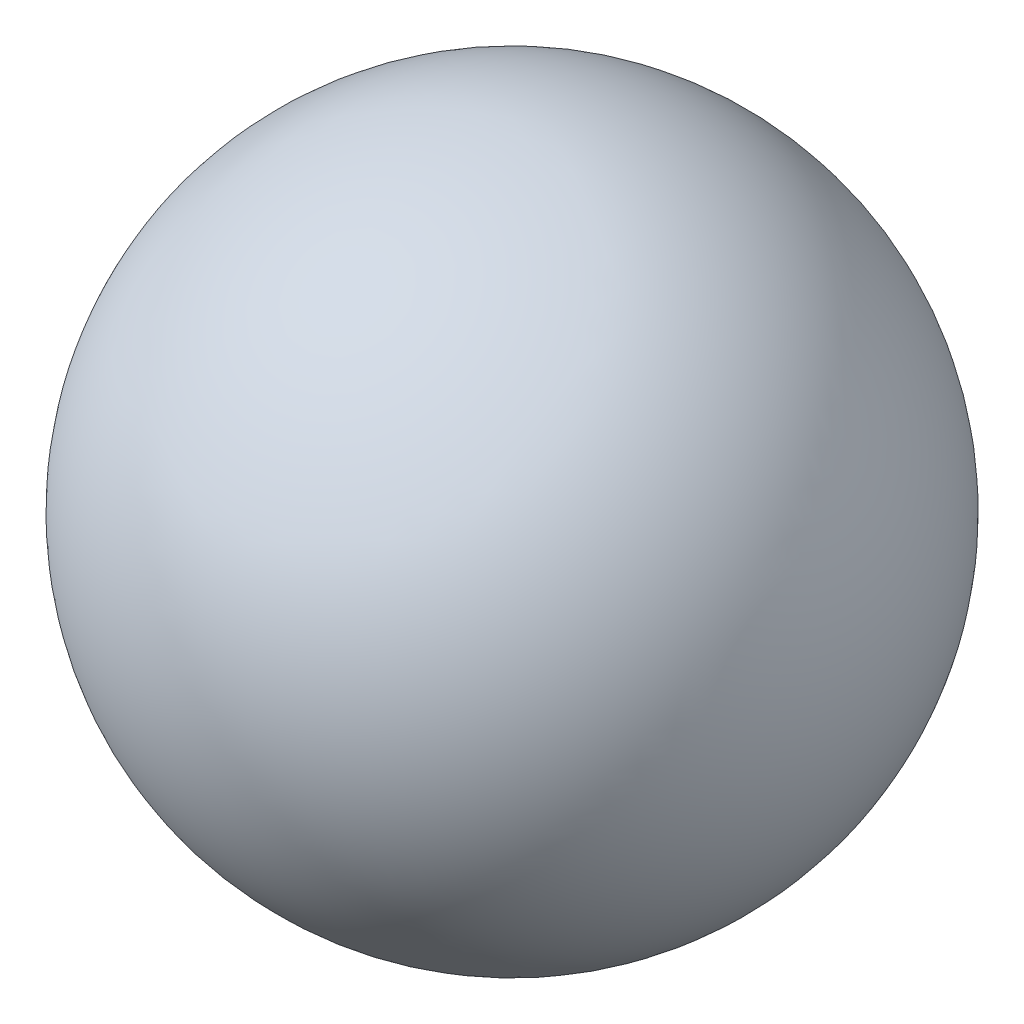
ISO-10303-21;
HEADER;
FILE_DESCRIPTION(('STEP AP214'),'2;1');
FILE_NAME('part.step','',(''),(''),'','','');
FILE_SCHEMA(('AUTOMOTIVE_DESIGN { 1 0 10303 214 1 1 1 1 }'));
ENDSEC;
DATA;
#1=APPLICATION_CONTEXT('core data for automotive mechanical design processes');
#2=APPLICATION_PROTOCOL_DEFINITION('international standard','automotive_design',2000,#1);
#3=PRODUCT_CONTEXT('',#1,'mechanical');
#4=PRODUCT('Part','Part','',(#3));
#5=PRODUCT_RELATED_PRODUCT_CATEGORY('part','',(#4));
#6=PRODUCT_DEFINITION_FORMATION('','',#4);
#7=PRODUCT_DEFINITION_CONTEXT('part definition',#1,'design');
#8=PRODUCT_DEFINITION('design','',#6,#7);
#9=PRODUCT_DEFINITION_SHAPE('','',#8);
#10=(LENGTH_UNIT() NAMED_UNIT(*) SI_UNIT(.MILLI.,.METRE.));
#11=(NAMED_UNIT(*) PLANE_ANGLE_UNIT() SI_UNIT($,.RADIAN.));
#12=(NAMED_UNIT(*) SI_UNIT($,.STERADIAN.) SOLID_ANGLE_UNIT());
#13=UNCERTAINTY_MEASURE_WITH_UNIT(LENGTH_MEASURE(1.E-05),#10,'distance_accuracy_value','');
#14=(GEOMETRIC_REPRESENTATION_CONTEXT(3) GLOBAL_UNCERTAINTY_ASSIGNED_CONTEXT((#13)) GLOBAL_UNIT_ASSIGNED_CONTEXT((#10,
#11,#12)) REPRESENTATION_CONTEXT('',''));
#15=CARTESIAN_POINT('',(0.,0.,0.));
#16=DIRECTION('',(0.,0.,1.));
#17=DIRECTION('',(1.,0.,0.));
#18=AXIS2_PLACEMENT_3D('',#15,#16,#17);
#19=CARTESIAN_POINT('',(3.7,0.,-3.95));
#20=DIRECTION('',(-1.,0.,0.));
#21=DIRECTION('',(0.,0.,1.));
#22=AXIS2_PLACEMENT_3D('',#19,#20,#21);
#23=SPHERICAL_SURFACE('',#22,2.55);
#24=CARTESIAN_POINT('',(1.15,0.,-3.95));
#25=VERTEX_POINT('',#24);
#26=VERTEX_LOOP('',#25);
#27=FACE_BOUND('',#26,.T.);
#28=ADVANCED_FACE('F27',(#27),#23,.T.);
#29=CLOSED_SHELL('',(#28));
#30=MANIFOLD_SOLID_BREP('B2',#29);
#31=ADVANCED_BREP_SHAPE_REPRESENTATION('',(#18,#30),#14);
#32=SHAPE_DEFINITION_REPRESENTATION(#9,#31);
ENDSEC;
END-ISO-10303-21;
